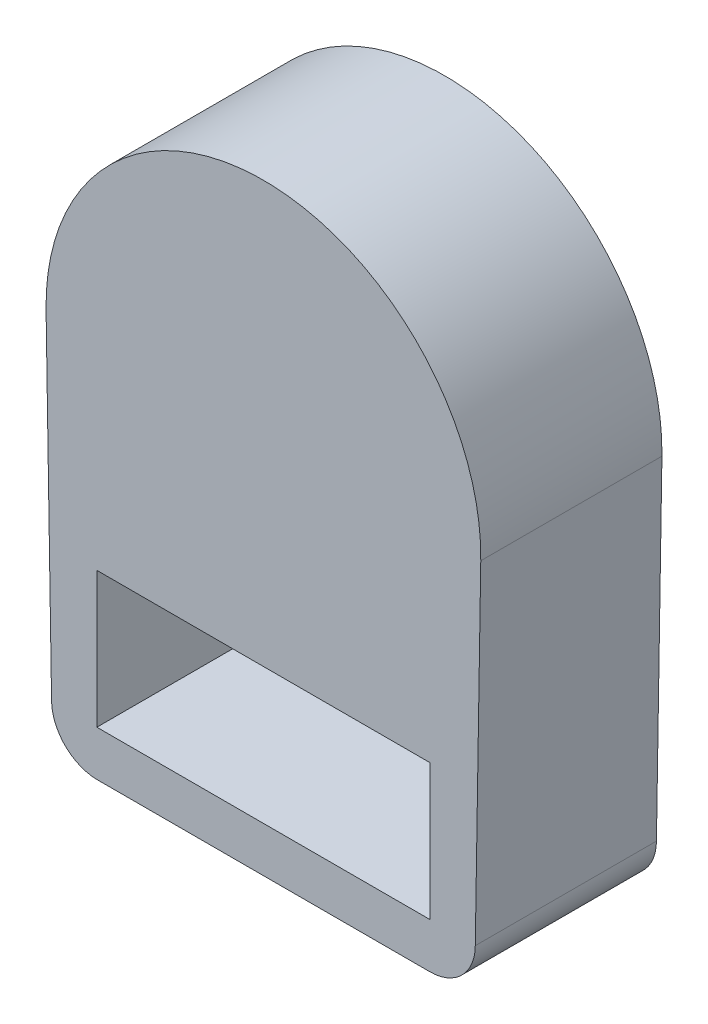
ISO-10303-21;
HEADER;
FILE_DESCRIPTION(('STEP AP214'),'2;1');
FILE_NAME('part.step','',(''),(''),'','','');
FILE_SCHEMA(('AUTOMOTIVE_DESIGN { 1 0 10303 214 1 1 1 1 }'));
ENDSEC;
DATA;
#1=APPLICATION_CONTEXT('core data for automotive mechanical design processes');
#2=APPLICATION_PROTOCOL_DEFINITION('international standard','automotive_design',2000,#1);
#3=PRODUCT_CONTEXT('',#1,'mechanical');
#4=PRODUCT('Part','Part','',(#3));
#5=PRODUCT_RELATED_PRODUCT_CATEGORY('part','',(#4));
#6=PRODUCT_DEFINITION_FORMATION('','',#4);
#7=PRODUCT_DEFINITION_CONTEXT('part definition',#1,'design');
#8=PRODUCT_DEFINITION('design','',#6,#7);
#9=PRODUCT_DEFINITION_SHAPE('','',#8);
#10=(LENGTH_UNIT() NAMED_UNIT(*) SI_UNIT(.MILLI.,.METRE.));
#11=(NAMED_UNIT(*) PLANE_ANGLE_UNIT() SI_UNIT($,.RADIAN.));
#12=(NAMED_UNIT(*) SI_UNIT($,.STERADIAN.) SOLID_ANGLE_UNIT());
#13=UNCERTAINTY_MEASURE_WITH_UNIT(LENGTH_MEASURE(1.E-05),#10,'distance_accuracy_value','');
#14=(GEOMETRIC_REPRESENTATION_CONTEXT(3) GLOBAL_UNCERTAINTY_ASSIGNED_CONTEXT((#13)) GLOBAL_UNIT_ASSIGNED_CONTEXT((#10,
#11,#12)) REPRESENTATION_CONTEXT('',''));
#15=CARTESIAN_POINT('',(0.,0.,0.));
#16=DIRECTION('',(0.,0.,1.));
#17=DIRECTION('',(1.,0.,0.));
#18=AXIS2_PLACEMENT_3D('',#15,#16,#17);
#19=CARTESIAN_POINT('',(-18.39,-7.5,15.));
#20=DIRECTION('',(0.,0.,-1.));
#21=DIRECTION('',(-1.,0.,0.));
#22=AXIS2_PLACEMENT_3D('',#19,#20,#21);
#23=PLANE('',#22);
#24=CARTESIAN_POINT('',(-18.3068796600086,-7.4168796600086,15.));
#25=DIRECTION('',(0.,0.,1.));
#26=DIRECTION('',(1.,0.,0.));
#27=AXIS2_PLACEMENT_3D('',#24,#25,#26);
#28=CIRCLE('',#27,5.08379989591984);
#29=CARTESIAN_POINT('',(-23.39,-7.5,15.));
#30=VERTEX_POINT('',#29);
#31=CARTESIAN_POINT('',(-18.39,-12.5,15.));
#32=VERTEX_POINT('',#31);
#33=EDGE_CURVE('E59',#30,#32,#28,.T.);
#34=ORIENTED_EDGE('',*,*,#33,.F.);
#35=CARTESIAN_POINT('',(-18.39,-7.5,15.));
#36=DIRECTION('',(0.,0.,1.));
#37=DIRECTION('',(-1.,0.,0.));
#38=AXIS2_PLACEMENT_3D('',#35,#36,#37);
#39=CIRCLE('',#38,5.);
#40=EDGE_CURVE('E113',#30,#32,#39,.T.);
#41=ORIENTED_EDGE('',*,*,#40,.T.);
#42=EDGE_LOOP('',(#34,#41));
#43=FACE_BOUND('',#42,.T.);
#44=ADVANCED_FACE('F36',(#43),#23,.F.);
#45=CARTESIAN_POINT('',(-18.39,-7.5,0.));
#46=DIRECTION('',(0.,0.,-1.));
#47=DIRECTION('',(-1.,0.,0.));
#48=AXIS2_PLACEMENT_3D('',#45,#46,#47);
#49=PLANE('',#48);
#50=DIRECTION('',(1.,0.,0.));
#51=VECTOR('',#50,1.);
#52=CARTESIAN_POINT('',(-18.39,-7.5,0.));
#53=LINE('',#52,#51);
#54=CARTESIAN_POINT('',(-18.39,-7.5,0.));
#55=VERTEX_POINT('',#54);
#56=CARTESIAN_POINT('',(18.39,-7.5,0.));
#57=VERTEX_POINT('',#56);
#58=EDGE_CURVE('E151',#55,#57,#53,.T.);
#59=ORIENTED_EDGE('',*,*,#58,.T.);
#60=DIRECTION('',(0.,1.,0.));
#61=VECTOR('',#60,1.);
#62=CARTESIAN_POINT('',(18.39,7.5,0.));
#63=LINE('',#62,#61);
#64=CARTESIAN_POINT('',(18.39,7.5,0.));
#65=VERTEX_POINT('',#64);
#66=EDGE_CURVE('E51',#57,#65,#63,.T.);
#67=ORIENTED_EDGE('',*,*,#66,.T.);
#68=DIRECTION('',(-1.,0.,0.));
#69=VECTOR('',#68,1.);
#70=CARTESIAN_POINT('',(-18.39,7.5,0.));
#71=LINE('',#70,#69);
#72=CARTESIAN_POINT('',(-18.39,7.5,0.));
#73=VERTEX_POINT('',#72);
#74=EDGE_CURVE('E157',#65,#73,#71,.T.);
#75=ORIENTED_EDGE('',*,*,#74,.T.);
#76=DIRECTION('',(0.,-1.,0.));
#77=VECTOR('',#76,1.);
#78=CARTESIAN_POINT('',(-18.39,7.5,0.));
#79=LINE('',#78,#77);
#80=EDGE_CURVE('E154',#73,#55,#79,.T.);
#81=ORIENTED_EDGE('',*,*,#80,.T.);
#82=EDGE_LOOP('',(#59,#67,#75,#81));
#83=FACE_BOUND('',#82,.T.);
#84=CARTESIAN_POINT('',(-18.39,-7.5,0.));
#85=DIRECTION('',(0.,0.,1.));
#86=DIRECTION('',(-1.,0.,0.));
#87=AXIS2_PLACEMENT_3D('',#84,#85,#86);
#88=CIRCLE('',#87,5.);
#89=CARTESIAN_POINT('',(-23.39,-7.5,0.));
#90=VERTEX_POINT('',#89);
#91=CARTESIAN_POINT('',(-18.39,-12.5,0.));
#92=VERTEX_POINT('',#91);
#93=EDGE_CURVE('E112',#90,#92,#88,.T.);
#94=ORIENTED_EDGE('',*,*,#93,.F.);
#95=DIRECTION('',(0.0163500416407234,-0.999866329135223,0.));
#96=VECTOR('',#95,1.);
#97=CARTESIAN_POINT('',(-23.9967918992454,29.6075990006226,0.));
#98=LINE('',#97,#96);
#99=CARTESIAN_POINT('',(-23.9967918992454,29.6075990006227,0.));
#100=VERTEX_POINT('',#99);
#101=EDGE_CURVE('E96',#100,#90,#98,.T.);
#102=ORIENTED_EDGE('',*,*,#101,.F.);
#103=CARTESIAN_POINT('',(0.,30.,0.));
#104=DIRECTION('',(0.,0.,1.));
#105=DIRECTION('',(1.,0.,0.));
#106=AXIS2_PLACEMENT_3D('',#103,#104,#105);
#107=CIRCLE('',#106,24.);
#108=CARTESIAN_POINT('',(23.9967918992454,29.6075990006226,0.));
#109=VERTEX_POINT('',#108);
#110=EDGE_CURVE('E84',#109,#100,#107,.T.);
#111=ORIENTED_EDGE('',*,*,#110,.F.);
#112=DIRECTION('',(0.0163500416407234,0.999866329135223,0.));
#113=VECTOR('',#112,1.);
#114=CARTESIAN_POINT('',(23.9967918992454,29.6075990006226,0.));
#115=LINE('',#114,#113);
#116=CARTESIAN_POINT('',(23.39,-7.5,0.));
#117=VERTEX_POINT('',#116);
#118=EDGE_CURVE('E97',#117,#109,#115,.T.);
#119=ORIENTED_EDGE('',*,*,#118,.F.);
#120=CARTESIAN_POINT('',(18.39,-7.5,0.));
#121=DIRECTION('',(0.,0.,1.));
#122=DIRECTION('',(1.,0.,0.));
#123=AXIS2_PLACEMENT_3D('',#120,#121,#122);
#124=CIRCLE('',#123,5.);
#125=CARTESIAN_POINT('',(18.39,-12.5,0.));
#126=VERTEX_POINT('',#125);
#127=EDGE_CURVE('E129',#126,#117,#124,.T.);
#128=ORIENTED_EDGE('',*,*,#127,.F.);
#129=DIRECTION('',(1.,0.,0.));
#130=VECTOR('',#129,1.);
#131=CARTESIAN_POINT('',(-18.39,-12.5,0.));
#132=LINE('',#131,#130);
#133=EDGE_CURVE('E136',#92,#126,#132,.T.);
#134=ORIENTED_EDGE('',*,*,#133,.F.);
#135=EDGE_LOOP('',(#94,#102,#111,#119,#128,#134));
#136=FACE_BOUND('',#135,.T.);
#137=CARTESIAN_POINT('',(0.,30.,0.));
#138=DIRECTION('',(0.,0.,1.));
#139=DIRECTION('',(1.,0.,0.));
#140=AXIS2_PLACEMENT_3D('',#137,#138,#139);
#141=CIRCLE('',#140,19.);
#142=CARTESIAN_POINT('',(19.,30.,0.));
#143=VERTEX_POINT('',#142);
#144=EDGE_CURVE('E161',#143,#143,#141,.T.);
#145=ORIENTED_EDGE('',*,*,#144,.T.);
#146=EDGE_LOOP('',(#145));
#147=FACE_BOUND('',#146,.T.);
#148=ADVANCED_FACE('F109',(#83,#136,#147),#49,.T.);
#149=CARTESIAN_POINT('',(-18.39,-7.5,15.));
#150=DIRECTION('',(0.,0.,-1.));
#151=DIRECTION('',(-1.,0.,0.));
#152=AXIS2_PLACEMENT_3D('',#149,#150,#151);
#153=CYLINDRICAL_SURFACE('',#152,5.);
#154=ORIENTED_EDGE('',*,*,#93,.T.);
#155=DIRECTION('',(0.,0.,-1.));
#156=VECTOR('',#155,1.);
#157=CARTESIAN_POINT('',(-18.39,-12.5,15.));
#158=LINE('',#157,#156);
#159=EDGE_CURVE('E11',#32,#92,#158,.T.);
#160=ORIENTED_EDGE('',*,*,#159,.F.);
#161=ORIENTED_EDGE('',*,*,#40,.F.);
#162=DIRECTION('',(0.,0.,-1.));
#163=VECTOR('',#162,1.);
#164=CARTESIAN_POINT('',(-23.39,-7.5,15.));
#165=LINE('',#164,#163);
#166=EDGE_CURVE('E106',#30,#90,#165,.T.);
#167=ORIENTED_EDGE('',*,*,#166,.T.);
#168=EDGE_LOOP('',(#154,#160,#161,#167));
#169=FACE_BOUND('',#168,.T.);
#170=ADVANCED_FACE('F38',(#169),#153,.T.);
#171=CARTESIAN_POINT('',(-18.39,-12.5,15.));
#172=DIRECTION('',(0.,1.,0.));
#173=DIRECTION('',(-1.,0.,0.));
#174=AXIS2_PLACEMENT_3D('',#171,#172,#173);
#175=PLANE('',#174);
#176=ORIENTED_EDGE('',*,*,#133,.T.);
#177=DIRECTION('',(0.,0.,-1.));
#178=VECTOR('',#177,1.);
#179=CARTESIAN_POINT('',(18.39,-12.5,15.));
#180=LINE('',#179,#178);
#181=CARTESIAN_POINT('',(18.39,-12.5,20.));
#182=VERTEX_POINT('',#181);
#183=EDGE_CURVE('E44',#182,#126,#180,.T.);
#184=ORIENTED_EDGE('',*,*,#183,.F.);
#185=DIRECTION('',(1.,0.,0.));
#186=VECTOR('',#185,1.);
#187=CARTESIAN_POINT('',(0.,-12.5,20.));
#188=LINE('',#187,#186);
#189=CARTESIAN_POINT('',(-18.39,-12.5,20.));
#190=VERTEX_POINT('',#189);
#191=EDGE_CURVE('E181',#190,#182,#188,.T.);
#192=ORIENTED_EDGE('',*,*,#191,.F.);
#193=DIRECTION('',(0.,0.,-1.));
#194=VECTOR('',#193,1.);
#195=CARTESIAN_POINT('',(-18.39,-12.5,20.));
#196=LINE('',#195,#194);
#197=EDGE_CURVE('E170',#190,#32,#196,.T.);
#198=ORIENTED_EDGE('',*,*,#197,.T.);
#199=ORIENTED_EDGE('',*,*,#159,.T.);
#200=EDGE_LOOP('',(#176,#184,#192,#198,#199));
#201=FACE_BOUND('',#200,.T.);
#202=ADVANCED_FACE('F265',(#201),#175,.F.);
#203=CARTESIAN_POINT('',(18.39,-7.5,15.));
#204=DIRECTION('',(0.,0.,-1.));
#205=DIRECTION('',(-1.,0.,0.));
#206=AXIS2_PLACEMENT_3D('',#203,#204,#205);
#207=CYLINDRICAL_SURFACE('',#206,5.);
#208=ORIENTED_EDGE('',*,*,#127,.T.);
#209=DIRECTION('',(0.,0.,-1.));
#210=VECTOR('',#209,1.);
#211=CARTESIAN_POINT('',(23.39,-7.5,15.));
#212=LINE('',#211,#210);
#213=CARTESIAN_POINT('',(23.39,-7.49999999999999,20.));
#214=VERTEX_POINT('',#213);
#215=EDGE_CURVE('E120',#214,#117,#212,.T.);
#216=ORIENTED_EDGE('',*,*,#215,.F.);
#217=CARTESIAN_POINT('',(18.39,-7.5,20.));
#218=DIRECTION('',(0.,0.,1.));
#219=DIRECTION('',(1.,0.,0.));
#220=AXIS2_PLACEMENT_3D('',#217,#218,#219);
#221=CIRCLE('',#220,5.);
#222=EDGE_CURVE('E132',#182,#214,#221,.T.);
#223=ORIENTED_EDGE('',*,*,#222,.F.);
#224=ORIENTED_EDGE('',*,*,#183,.T.);
#225=EDGE_LOOP('',(#208,#216,#223,#224));
#226=FACE_BOUND('',#225,.T.);
#227=ADVANCED_FACE('F127',(#226),#207,.T.);
#228=CARTESIAN_POINT('',(23.9967918992454,29.6075990006226,15.));
#229=DIRECTION('',(-0.999866329135223,0.0163500416407234,0.));
#230=DIRECTION('',(-0.0163500416407234,-0.999866329135223,0.));
#231=AXIS2_PLACEMENT_3D('',#228,#229,#230);
#232=PLANE('',#231);
#233=ORIENTED_EDGE('',*,*,#118,.T.);
#234=DIRECTION('',(0.,0.,-1.));
#235=VECTOR('',#234,1.);
#236=CARTESIAN_POINT('',(23.9967918992454,29.6075990006226,15.));
#237=LINE('',#236,#235);
#238=CARTESIAN_POINT('',(23.9967918992454,29.6075990006226,20.));
#239=VERTEX_POINT('',#238);
#240=EDGE_CURVE('E92',#239,#109,#237,.T.);
#241=ORIENTED_EDGE('',*,*,#240,.F.);
#242=DIRECTION('',(0.0163500416407234,0.999866329135223,0.));
#243=VECTOR('',#242,1.);
#244=CARTESIAN_POINT('',(23.5063562157498,-0.38438128352776,20.));
#245=LINE('',#244,#243);
#246=EDGE_CURVE('E177',#214,#239,#245,.T.);
#247=ORIENTED_EDGE('',*,*,#246,.F.);
#248=ORIENTED_EDGE('',*,*,#215,.T.);
#249=EDGE_LOOP('',(#233,#241,#247,#248));
#250=FACE_BOUND('',#249,.T.);
#251=ADVANCED_FACE('F260',(#250),#232,.F.);
#252=CARTESIAN_POINT('',(0.,30.,15.));
#253=DIRECTION('',(0.,0.,-1.));
#254=DIRECTION('',(-1.,0.,0.));
#255=AXIS2_PLACEMENT_3D('',#252,#253,#254);
#256=CYLINDRICAL_SURFACE('',#255,24.);
#257=ORIENTED_EDGE('',*,*,#110,.T.);
#258=DIRECTION('',(0.,0.,-1.));
#259=VECTOR('',#258,1.);
#260=CARTESIAN_POINT('',(-23.9967918992454,29.6075990006227,15.));
#261=LINE('',#260,#259);
#262=CARTESIAN_POINT('',(-23.9967918992454,29.6075990006227,20.));
#263=VERTEX_POINT('',#262);
#264=EDGE_CURVE('E89',#263,#100,#261,.T.);
#265=ORIENTED_EDGE('',*,*,#264,.F.);
#266=CARTESIAN_POINT('',(0.,30.,20.));
#267=DIRECTION('',(0.,0.,1.));
#268=DIRECTION('',(1.,0.,0.));
#269=AXIS2_PLACEMENT_3D('',#266,#267,#268);
#270=CIRCLE('',#269,24.);
#271=EDGE_CURVE('E173',#239,#263,#270,.T.);
#272=ORIENTED_EDGE('',*,*,#271,.F.);
#273=ORIENTED_EDGE('',*,*,#240,.T.);
#274=EDGE_LOOP('',(#257,#265,#272,#273));
#275=FACE_BOUND('',#274,.T.);
#276=ADVANCED_FACE('F86',(#275),#256,.T.);
#277=CARTESIAN_POINT('',(-23.9967918992454,29.6075990006226,15.));
#278=DIRECTION('',(0.999866329135223,0.0163500416407234,0.));
#279=DIRECTION('',(-0.0163500416407234,0.999866329135223,0.));
#280=AXIS2_PLACEMENT_3D('',#277,#278,#279);
#281=PLANE('',#280);
#282=ORIENTED_EDGE('',*,*,#101,.T.);
#283=ORIENTED_EDGE('',*,*,#166,.F.);
#284=DIRECTION('',(0.,0.,-1.));
#285=VECTOR('',#284,1.);
#286=CARTESIAN_POINT('',(-23.39,-7.49999999999999,20.));
#287=LINE('',#286,#285);
#288=CARTESIAN_POINT('',(-23.39,-7.49999999999999,20.));
#289=VERTEX_POINT('',#288);
#290=EDGE_CURVE('E167',#289,#30,#287,.T.);
#291=ORIENTED_EDGE('',*,*,#290,.F.);
#292=DIRECTION('',(0.0163500416407234,-0.999866329135223,0.));
#293=VECTOR('',#292,1.);
#294=CARTESIAN_POINT('',(-23.5063562157498,-0.38438128352776,20.));
#295=LINE('',#294,#293);
#296=EDGE_CURVE('E105',#263,#289,#295,.T.);
#297=ORIENTED_EDGE('',*,*,#296,.F.);
#298=ORIENTED_EDGE('',*,*,#264,.T.);
#299=EDGE_LOOP('',(#282,#283,#291,#297,#298));
#300=FACE_BOUND('',#299,.T.);
#301=ADVANCED_FACE('F101',(#300),#281,.F.);
#302=CARTESIAN_POINT('',(18.39,7.5,15.));
#303=DIRECTION('',(-1.,0.,0.));
#304=DIRECTION('',(0.,0.,1.));
#305=AXIS2_PLACEMENT_3D('',#302,#303,#304);
#306=PLANE('',#305);
#307=ORIENTED_EDGE('',*,*,#66,.F.);
#308=DIRECTION('',(0.,0.,-1.));
#309=VECTOR('',#308,1.);
#310=CARTESIAN_POINT('',(18.39,-7.5,15.));
#311=LINE('',#310,#309);
#312=CARTESIAN_POINT('',(18.39,-7.5,20.));
#313=VERTEX_POINT('',#312);
#314=EDGE_CURVE('E149',#313,#57,#311,.T.);
#315=ORIENTED_EDGE('',*,*,#314,.F.);
#316=DIRECTION('',(0.,-1.,0.));
#317=VECTOR('',#316,1.);
#318=CARTESIAN_POINT('',(18.39,0.,20.));
#319=LINE('',#318,#317);
#320=CARTESIAN_POINT('',(18.39,7.5,20.));
#321=VERTEX_POINT('',#320);
#322=EDGE_CURVE('E193',#321,#313,#319,.T.);
#323=ORIENTED_EDGE('',*,*,#322,.F.);
#324=DIRECTION('',(0.,0.,-1.));
#325=VECTOR('',#324,1.);
#326=CARTESIAN_POINT('',(18.39,7.5,15.));
#327=LINE('',#326,#325);
#328=EDGE_CURVE('E140',#321,#65,#327,.T.);
#329=ORIENTED_EDGE('',*,*,#328,.T.);
#330=EDGE_LOOP('',(#307,#315,#323,#329));
#331=FACE_BOUND('',#330,.T.);
#332=ADVANCED_FACE('F242',(#331),#306,.T.);
#333=CARTESIAN_POINT('',(-18.39,7.5,15.));
#334=DIRECTION('',(0.,-1.,0.));
#335=DIRECTION('',(0.,0.,-1.));
#336=AXIS2_PLACEMENT_3D('',#333,#334,#335);
#337=PLANE('',#336);
#338=ORIENTED_EDGE('',*,*,#74,.F.);
#339=ORIENTED_EDGE('',*,*,#328,.F.);
#340=DIRECTION('',(1.,0.,0.));
#341=VECTOR('',#340,1.);
#342=CARTESIAN_POINT('',(0.,7.5,20.));
#343=LINE('',#342,#341);
#344=CARTESIAN_POINT('',(-18.39,7.5,20.));
#345=VERTEX_POINT('',#344);
#346=EDGE_CURVE('E175',#345,#321,#343,.T.);
#347=ORIENTED_EDGE('',*,*,#346,.F.);
#348=DIRECTION('',(0.,0.,-1.));
#349=VECTOR('',#348,1.);
#350=CARTESIAN_POINT('',(-18.39,7.5,15.));
#351=LINE('',#350,#349);
#352=EDGE_CURVE('E143',#345,#73,#351,.T.);
#353=ORIENTED_EDGE('',*,*,#352,.T.);
#354=EDGE_LOOP('',(#338,#339,#347,#353));
#355=FACE_BOUND('',#354,.T.);
#356=ADVANCED_FACE('F212',(#355),#337,.T.);
#357=CARTESIAN_POINT('',(-18.39,7.5,15.));
#358=DIRECTION('',(1.,0.,0.));
#359=DIRECTION('',(0.,0.,-1.));
#360=AXIS2_PLACEMENT_3D('',#357,#358,#359);
#361=PLANE('',#360);
#362=ORIENTED_EDGE('',*,*,#80,.F.);
#363=ORIENTED_EDGE('',*,*,#352,.F.);
#364=DIRECTION('',(0.,1.,0.));
#365=VECTOR('',#364,1.);
#366=CARTESIAN_POINT('',(-18.39,0.,20.));
#367=LINE('',#366,#365);
#368=CARTESIAN_POINT('',(-18.39,-7.5,20.));
#369=VERTEX_POINT('',#368);
#370=EDGE_CURVE('E187',#369,#345,#367,.T.);
#371=ORIENTED_EDGE('',*,*,#370,.F.);
#372=DIRECTION('',(0.,0.,-1.));
#373=VECTOR('',#372,1.);
#374=CARTESIAN_POINT('',(-18.39,-7.5,15.));
#375=LINE('',#374,#373);
#376=EDGE_CURVE('E146',#369,#55,#375,.T.);
#377=ORIENTED_EDGE('',*,*,#376,.T.);
#378=EDGE_LOOP('',(#362,#363,#371,#377));
#379=FACE_BOUND('',#378,.T.);
#380=ADVANCED_FACE('F238',(#379),#361,.T.);
#381=CARTESIAN_POINT('',(-18.39,-7.5,15.));
#382=DIRECTION('',(0.,1.,0.));
#383=DIRECTION('',(0.,0.,1.));
#384=AXIS2_PLACEMENT_3D('',#381,#382,#383);
#385=PLANE('',#384);
#386=ORIENTED_EDGE('',*,*,#58,.F.);
#387=ORIENTED_EDGE('',*,*,#376,.F.);
#388=DIRECTION('',(-1.,0.,0.));
#389=VECTOR('',#388,1.);
#390=CARTESIAN_POINT('',(0.,-7.5,20.));
#391=LINE('',#390,#389);
#392=EDGE_CURVE('E190',#313,#369,#391,.T.);
#393=ORIENTED_EDGE('',*,*,#392,.F.);
#394=ORIENTED_EDGE('',*,*,#314,.T.);
#395=EDGE_LOOP('',(#386,#387,#393,#394));
#396=FACE_BOUND('',#395,.T.);
#397=ADVANCED_FACE('F240',(#396),#385,.T.);
#398=CARTESIAN_POINT('',(0.,30.,15.));
#399=DIRECTION('',(0.,0.,-1.));
#400=DIRECTION('',(-1.,0.,0.));
#401=AXIS2_PLACEMENT_3D('',#398,#399,#400);
#402=CYLINDRICAL_SURFACE('',#401,19.);
#403=CARTESIAN_POINT('',(0.,30.,15.));
#404=DIRECTION('',(0.,0.,1.));
#405=DIRECTION('',(1.,0.,0.));
#406=AXIS2_PLACEMENT_3D('',#403,#404,#405);
#407=CIRCLE('',#406,19.);
#408=CARTESIAN_POINT('',(19.,30.,15.));
#409=VERTEX_POINT('',#408);
#410=EDGE_CURVE('E164',#409,#409,#407,.T.);
#411=ORIENTED_EDGE('',*,*,#410,.T.);
#412=EDGE_LOOP('',(#411));
#413=FACE_BOUND('',#412,.T.);
#414=ORIENTED_EDGE('',*,*,#144,.F.);
#415=EDGE_LOOP('',(#414));
#416=FACE_BOUND('',#415,.T.);
#417=ADVANCED_FACE('F277',(#413,#416),#402,.F.);
#418=CARTESIAN_POINT('',(0.,0.,20.));
#419=DIRECTION('',(0.,0.,1.));
#420=DIRECTION('',(1.,0.,0.));
#421=AXIS2_PLACEMENT_3D('',#418,#419,#420);
#422=PLANE('',#421);
#423=ORIENTED_EDGE('',*,*,#346,.T.);
#424=ORIENTED_EDGE('',*,*,#322,.T.);
#425=ORIENTED_EDGE('',*,*,#392,.T.);
#426=ORIENTED_EDGE('',*,*,#370,.T.);
#427=EDGE_LOOP('',(#423,#424,#425,#426));
#428=FACE_BOUND('',#427,.T.);
#429=ORIENTED_EDGE('',*,*,#296,.T.);
#430=CARTESIAN_POINT('',(-18.3068796600086,-7.4168796600086,20.));
#431=DIRECTION('',(0.,0.,1.));
#432=DIRECTION('',(1.,0.,0.));
#433=AXIS2_PLACEMENT_3D('',#430,#431,#432);
#434=CIRCLE('',#433,5.08379989591984);
#435=EDGE_CURVE('E183',#289,#190,#434,.T.);
#436=ORIENTED_EDGE('',*,*,#435,.T.);
#437=ORIENTED_EDGE('',*,*,#191,.T.);
#438=ORIENTED_EDGE('',*,*,#222,.T.);
#439=ORIENTED_EDGE('',*,*,#246,.T.);
#440=ORIENTED_EDGE('',*,*,#271,.T.);
#441=EDGE_LOOP('',(#429,#436,#437,#438,#439,#440));
#442=FACE_BOUND('',#441,.T.);
#443=ADVANCED_FACE('F200',(#428,#442),#422,.T.);
#444=CARTESIAN_POINT('',(-18.3068796600086,-7.4168796600086,20.));
#445=DIRECTION('',(0.,0.,-1.));
#446=DIRECTION('',(-1.,0.,0.));
#447=AXIS2_PLACEMENT_3D('',#444,#445,#446);
#448=CYLINDRICAL_SURFACE('',#447,5.08379989591984);
#449=ORIENTED_EDGE('',*,*,#33,.T.);
#450=ORIENTED_EDGE('',*,*,#197,.F.);
#451=ORIENTED_EDGE('',*,*,#435,.F.);
#452=ORIENTED_EDGE('',*,*,#290,.T.);
#453=EDGE_LOOP('',(#449,#450,#451,#452));
#454=FACE_BOUND('',#453,.T.);
#455=ADVANCED_FACE('F274',(#454),#448,.T.);
#456=CARTESIAN_POINT('',(0.,0.,15.));
#457=DIRECTION('',(0.,0.,1.));
#458=DIRECTION('',(1.,0.,0.));
#459=AXIS2_PLACEMENT_3D('',#456,#457,#458);
#460=PLANE('',#459);
#461=ORIENTED_EDGE('',*,*,#410,.F.);
#462=EDGE_LOOP('',(#461));
#463=FACE_BOUND('',#462,.T.);
#464=ADVANCED_FACE('F283',(#463),#460,.F.);
#465=CLOSED_SHELL('',(#44,#148,#170,#202,#227,#251,#276,#301,#332,#356,#380,#397,#417,#443,#455,#464));
#466=MANIFOLD_SOLID_BREP('B2',#465);
#467=ADVANCED_BREP_SHAPE_REPRESENTATION('',(#18,#466),#14);
#468=SHAPE_DEFINITION_REPRESENTATION(#9,#467);
ENDSEC;
END-ISO-10303-21;
